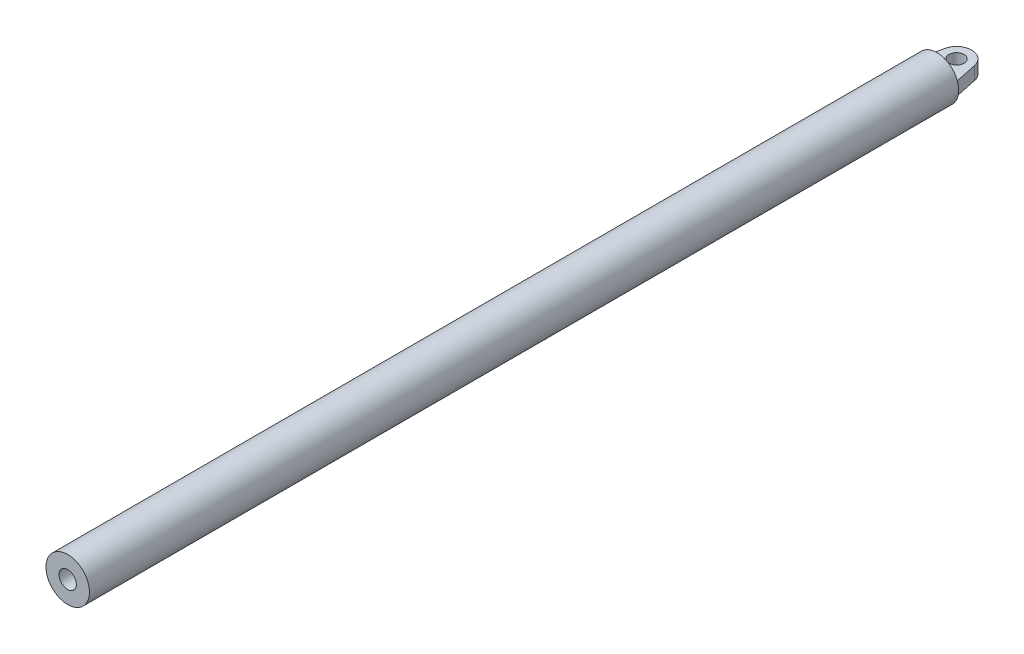
ISO-10303-21;
HEADER;
FILE_DESCRIPTION(('STEP AP214'),'2;1');
FILE_NAME('part.step','',(''),(''),'','','');
FILE_SCHEMA(('AUTOMOTIVE_DESIGN { 1 0 10303 214 1 1 1 1 }'));
ENDSEC;
DATA;
#1=APPLICATION_CONTEXT('core data for automotive mechanical design processes');
#2=APPLICATION_PROTOCOL_DEFINITION('international standard','automotive_design',2000,#1);
#3=PRODUCT_CONTEXT('',#1,'mechanical');
#4=PRODUCT('Part','Part','',(#3));
#5=PRODUCT_RELATED_PRODUCT_CATEGORY('part','',(#4));
#6=PRODUCT_DEFINITION_FORMATION('','',#4);
#7=PRODUCT_DEFINITION_CONTEXT('part definition',#1,'design');
#8=PRODUCT_DEFINITION('design','',#6,#7);
#9=PRODUCT_DEFINITION_SHAPE('','',#8);
#10=(LENGTH_UNIT() NAMED_UNIT(*) SI_UNIT(.MILLI.,.METRE.));
#11=(NAMED_UNIT(*) PLANE_ANGLE_UNIT() SI_UNIT($,.RADIAN.));
#12=(NAMED_UNIT(*) SI_UNIT($,.STERADIAN.) SOLID_ANGLE_UNIT());
#13=UNCERTAINTY_MEASURE_WITH_UNIT(LENGTH_MEASURE(1.E-05),#10,'distance_accuracy_value','');
#14=(GEOMETRIC_REPRESENTATION_CONTEXT(3) GLOBAL_UNCERTAINTY_ASSIGNED_CONTEXT((#13)) GLOBAL_UNIT_ASSIGNED_CONTEXT((#10,
#11,#12)) REPRESENTATION_CONTEXT('',''));
#15=CARTESIAN_POINT('',(0.,0.,0.));
#16=DIRECTION('',(0.,0.,1.));
#17=DIRECTION('',(1.,0.,0.));
#18=AXIS2_PLACEMENT_3D('',#15,#16,#17);
#19=CARTESIAN_POINT('',(0.,0.,2000.));
#20=DIRECTION('',(0.,0.,-1.));
#21=DIRECTION('',(-1.,0.,0.));
#22=AXIS2_PLACEMENT_3D('',#19,#20,#21);
#23=CYLINDRICAL_SURFACE('',#22,50.);
#24=CARTESIAN_POINT('',(0.,0.,2000.));
#25=DIRECTION('',(0.,0.,1.));
#26=DIRECTION('',(1.,0.,0.));
#27=AXIS2_PLACEMENT_3D('',#24,#25,#26);
#28=CIRCLE('',#27,50.);
#29=CARTESIAN_POINT('',(50.,0.,2000.));
#30=VERTEX_POINT('',#29);
#31=EDGE_CURVE('E11',#30,#30,#28,.T.);
#32=ORIENTED_EDGE('',*,*,#31,.F.);
#33=EDGE_LOOP('',(#32));
#34=FACE_BOUND('',#33,.T.);
#35=CARTESIAN_POINT('',(0.,0.,0.));
#36=DIRECTION('',(0.,0.,1.));
#37=DIRECTION('',(1.,0.,0.));
#38=AXIS2_PLACEMENT_3D('',#35,#36,#37);
#39=CIRCLE('',#38,50.);
#40=CARTESIAN_POINT('',(50.,0.,0.));
#41=VERTEX_POINT('',#40);
#42=EDGE_CURVE('E37',#41,#41,#39,.T.);
#43=ORIENTED_EDGE('',*,*,#42,.T.);
#44=EDGE_LOOP('',(#43));
#45=FACE_BOUND('',#44,.T.);
#46=ADVANCED_FACE('F34',(#34,#45),#23,.T.);
#47=CARTESIAN_POINT('',(0.,0.,2000.));
#48=DIRECTION('',(0.,0.,1.));
#49=DIRECTION('',(1.,0.,0.));
#50=AXIS2_PLACEMENT_3D('',#47,#48,#49);
#51=PLANE('',#50);
#52=CARTESIAN_POINT('',(0.,0.,2000.));
#53=DIRECTION('',(0.,0.,1.));
#54=DIRECTION('',(1.,0.,0.));
#55=AXIS2_PLACEMENT_3D('',#52,#53,#54);
#56=CIRCLE('',#55,20.);
#57=CARTESIAN_POINT('',(20.,0.,2000.));
#58=VERTEX_POINT('',#57);
#59=EDGE_CURVE('E116',#58,#58,#56,.T.);
#60=ORIENTED_EDGE('',*,*,#59,.F.);
#61=EDGE_LOOP('',(#60));
#62=FACE_BOUND('',#61,.T.);
#63=ORIENTED_EDGE('',*,*,#31,.T.);
#64=EDGE_LOOP('',(#63));
#65=FACE_BOUND('',#64,.T.);
#66=ADVANCED_FACE('F127',(#62,#65),#51,.T.);
#67=CARTESIAN_POINT('',(0.,0.,0.));
#68=DIRECTION('',(0.,0.,1.));
#69=DIRECTION('',(1.,0.,0.));
#70=AXIS2_PLACEMENT_3D('',#67,#68,#69);
#71=PLANE('',#70);
#72=DIRECTION('',(0.,-1.,0.));
#73=VECTOR('',#72,1.);
#74=CARTESIAN_POINT('',(-45.,15.,0.));
#75=LINE('',#74,#73);
#76=CARTESIAN_POINT('',(-45.,15.,0.));
#77=VERTEX_POINT('',#76);
#78=CARTESIAN_POINT('',(-45.,-15.,0.));
#79=VERTEX_POINT('',#78);
#80=EDGE_CURVE('E99',#77,#79,#75,.T.);
#81=ORIENTED_EDGE('',*,*,#80,.T.);
#82=DIRECTION('',(1.,0.,0.));
#83=VECTOR('',#82,1.);
#84=CARTESIAN_POINT('',(-45.,-15.,0.));
#85=LINE('',#84,#83);
#86=CARTESIAN_POINT('',(45.,-15.,0.));
#87=VERTEX_POINT('',#86);
#88=EDGE_CURVE('E48',#79,#87,#85,.T.);
#89=ORIENTED_EDGE('',*,*,#88,.T.);
#90=DIRECTION('',(0.,-1.,0.));
#91=VECTOR('',#90,1.);
#92=CARTESIAN_POINT('',(45.,15.,0.));
#93=LINE('',#92,#91);
#94=CARTESIAN_POINT('',(45.,15.,0.));
#95=VERTEX_POINT('',#94);
#96=EDGE_CURVE('E94',#95,#87,#93,.T.);
#97=ORIENTED_EDGE('',*,*,#96,.F.);
#98=DIRECTION('',(1.,0.,0.));
#99=VECTOR('',#98,1.);
#100=CARTESIAN_POINT('',(-45.,15.,0.));
#101=LINE('',#100,#99);
#102=EDGE_CURVE('E88',#77,#95,#101,.T.);
#103=ORIENTED_EDGE('',*,*,#102,.F.);
#104=EDGE_LOOP('',(#81,#89,#97,#103));
#105=FACE_BOUND('',#104,.T.);
#106=ORIENTED_EDGE('',*,*,#42,.F.);
#107=EDGE_LOOP('',(#106));
#108=FACE_BOUND('',#107,.T.);
#109=ADVANCED_FACE('F124',(#105,#108),#71,.F.);
#110=CARTESIAN_POINT('',(0.,0.,2000.));
#111=DIRECTION('',(0.,0.,-1.));
#112=DIRECTION('',(-1.,0.,0.));
#113=AXIS2_PLACEMENT_3D('',#110,#111,#112);
#114=CYLINDRICAL_SURFACE('',#113,20.);
#115=ORIENTED_EDGE('',*,*,#59,.T.);
#116=EDGE_LOOP('',(#115));
#117=FACE_BOUND('',#116,.T.);
#118=CARTESIAN_POINT('',(0.,0.,30.));
#119=DIRECTION('',(0.,0.,1.));
#120=DIRECTION('',(1.,0.,0.));
#121=AXIS2_PLACEMENT_3D('',#118,#119,#120);
#122=CIRCLE('',#121,20.);
#123=CARTESIAN_POINT('',(20.,0.,30.));
#124=VERTEX_POINT('',#123);
#125=EDGE_CURVE('E113',#124,#124,#122,.T.);
#126=ORIENTED_EDGE('',*,*,#125,.F.);
#127=EDGE_LOOP('',(#126));
#128=FACE_BOUND('',#127,.T.);
#129=ADVANCED_FACE('F126',(#117,#128),#114,.F.);
#130=CARTESIAN_POINT('',(0.,0.,30.));
#131=DIRECTION('',(0.,0.,1.));
#132=DIRECTION('',(1.,0.,0.));
#133=AXIS2_PLACEMENT_3D('',#130,#131,#132);
#134=PLANE('',#133);
#135=ORIENTED_EDGE('',*,*,#125,.T.);
#136=EDGE_LOOP('',(#135));
#137=FACE_BOUND('',#136,.T.);
#138=ADVANCED_FACE('F133',(#137),#134,.T.);
#139=CARTESIAN_POINT('',(0.,15.,-45.));
#140=DIRECTION('',(0.,-1.,0.));
#141=DIRECTION('',(0.,0.,-1.));
#142=AXIS2_PLACEMENT_3D('',#139,#140,#141);
#143=PLANE('',#142);
#144=ORIENTED_EDGE('',*,*,#102,.T.);
#145=DIRECTION('',(-0.201674767374147,0.,-0.979452545151925));
#146=VECTOR('',#145,1.);
#147=CARTESIAN_POINT('',(34.2808390803174,15.,-52.0586168580951));
#148=LINE('',#147,#146);
#149=CARTESIAN_POINT('',(34.2808390803174,15.,-52.0586168580952));
#150=VERTEX_POINT('',#149);
#151=EDGE_CURVE('E82',#95,#150,#148,.T.);
#152=ORIENTED_EDGE('',*,*,#151,.T.);
#153=CARTESIAN_POINT('',(0.,15.,-45.));
#154=DIRECTION('',(0.,1.,0.));
#155=DIRECTION('',(0.,0.,-1.));
#156=AXIS2_PLACEMENT_3D('',#153,#154,#155);
#157=CIRCLE('',#156,35.);
#158=CARTESIAN_POINT('',(-34.2808390803174,15.,-52.0586168580951));
#159=VERTEX_POINT('',#158);
#160=EDGE_CURVE('E86',#150,#159,#157,.T.);
#161=ORIENTED_EDGE('',*,*,#160,.T.);
#162=DIRECTION('',(-0.201674767374147,0.,0.979452545151925));
#163=VECTOR('',#162,1.);
#164=CARTESIAN_POINT('',(-45.,15.,0.));
#165=LINE('',#164,#163);
#166=EDGE_CURVE('E57',#159,#77,#165,.T.);
#167=ORIENTED_EDGE('',*,*,#166,.T.);
#168=EDGE_LOOP('',(#144,#152,#161,#167));
#169=FACE_BOUND('',#168,.T.);
#170=CARTESIAN_POINT('',(0.,15.,-45.));
#171=DIRECTION('',(0.,1.,0.));
#172=DIRECTION('',(0.,0.,1.));
#173=AXIS2_PLACEMENT_3D('',#170,#171,#172);
#174=CIRCLE('',#173,17.5);
#175=CARTESIAN_POINT('',(0.,15.,-27.5));
#176=VERTEX_POINT('',#175);
#177=EDGE_CURVE('E104',#176,#176,#174,.T.);
#178=ORIENTED_EDGE('',*,*,#177,.F.);
#179=EDGE_LOOP('',(#178));
#180=FACE_BOUND('',#179,.T.);
#181=ADVANCED_FACE('F83',(#169,#180),#143,.F.);
#182=CARTESIAN_POINT('',(0.,-15.,-45.));
#183=DIRECTION('',(0.,-1.,0.));
#184=DIRECTION('',(0.,0.,-1.));
#185=AXIS2_PLACEMENT_3D('',#182,#183,#184);
#186=PLANE('',#185);
#187=ORIENTED_EDGE('',*,*,#88,.F.);
#188=DIRECTION('',(-0.201674767374147,0.,0.979452545151925));
#189=VECTOR('',#188,1.);
#190=CARTESIAN_POINT('',(-45.,-15.,0.));
#191=LINE('',#190,#189);
#192=CARTESIAN_POINT('',(-34.2808390803174,-15.,-52.0586168580951));
#193=VERTEX_POINT('',#192);
#194=EDGE_CURVE('E107',#193,#79,#191,.T.);
#195=ORIENTED_EDGE('',*,*,#194,.F.);
#196=CARTESIAN_POINT('',(0.,-15.,-45.));
#197=DIRECTION('',(0.,1.,0.));
#198=DIRECTION('',(0.,0.,-1.));
#199=AXIS2_PLACEMENT_3D('',#196,#197,#198);
#200=CIRCLE('',#199,35.);
#201=CARTESIAN_POINT('',(34.2808390803174,-15.,-52.0586168580952));
#202=VERTEX_POINT('',#201);
#203=EDGE_CURVE('E74',#202,#193,#200,.T.);
#204=ORIENTED_EDGE('',*,*,#203,.F.);
#205=DIRECTION('',(-0.201674767374147,0.,-0.979452545151925));
#206=VECTOR('',#205,1.);
#207=CARTESIAN_POINT('',(34.2808390803174,-15.,-52.0586168580951));
#208=LINE('',#207,#206);
#209=EDGE_CURVE('E93',#87,#202,#208,.T.);
#210=ORIENTED_EDGE('',*,*,#209,.F.);
#211=EDGE_LOOP('',(#187,#195,#204,#210));
#212=FACE_BOUND('',#211,.T.);
#213=CARTESIAN_POINT('',(0.,-15.,-45.));
#214=DIRECTION('',(0.,1.,0.));
#215=DIRECTION('',(0.,0.,1.));
#216=AXIS2_PLACEMENT_3D('',#213,#214,#215);
#217=CIRCLE('',#216,17.5);
#218=CARTESIAN_POINT('',(0.,-15.,-27.5));
#219=VERTEX_POINT('',#218);
#220=EDGE_CURVE('E228',#219,#219,#217,.T.);
#221=ORIENTED_EDGE('',*,*,#220,.T.);
#222=EDGE_LOOP('',(#221));
#223=FACE_BOUND('',#222,.T.);
#224=ADVANCED_FACE('F175',(#212,#223),#186,.T.);
#225=CARTESIAN_POINT('',(34.2808390803174,15.,-52.0586168580951));
#226=DIRECTION('',(-0.979452545151925,0.,0.201674767374147));
#227=DIRECTION('',(0.201674767374147,0.,0.979452545151925));
#228=AXIS2_PLACEMENT_3D('',#225,#226,#227);
#229=PLANE('',#228);
#230=ORIENTED_EDGE('',*,*,#209,.T.);
#231=DIRECTION('',(0.,-1.,0.));
#232=VECTOR('',#231,1.);
#233=CARTESIAN_POINT('',(34.2808390803174,15.,-52.0586168580952));
#234=LINE('',#233,#232);
#235=EDGE_CURVE('E91',#150,#202,#234,.T.);
#236=ORIENTED_EDGE('',*,*,#235,.F.);
#237=ORIENTED_EDGE('',*,*,#151,.F.);
#238=ORIENTED_EDGE('',*,*,#96,.T.);
#239=EDGE_LOOP('',(#230,#236,#237,#238));
#240=FACE_BOUND('',#239,.T.);
#241=ADVANCED_FACE('F92',(#240),#229,.F.);
#242=CARTESIAN_POINT('',(0.,15.,-45.));
#243=DIRECTION('',(0.,-1.,0.));
#244=DIRECTION('',(0.,0.,-1.));
#245=AXIS2_PLACEMENT_3D('',#242,#243,#244);
#246=CYLINDRICAL_SURFACE('',#245,35.);
#247=ORIENTED_EDGE('',*,*,#203,.T.);
#248=DIRECTION('',(0.,-1.,0.));
#249=VECTOR('',#248,1.);
#250=CARTESIAN_POINT('',(-34.2808390803174,15.,-52.0586168580951));
#251=LINE('',#250,#249);
#252=EDGE_CURVE('E95',#159,#193,#251,.T.);
#253=ORIENTED_EDGE('',*,*,#252,.F.);
#254=ORIENTED_EDGE('',*,*,#160,.F.);
#255=ORIENTED_EDGE('',*,*,#235,.T.);
#256=EDGE_LOOP('',(#247,#253,#254,#255));
#257=FACE_BOUND('',#256,.T.);
#258=ADVANCED_FACE('F97',(#257),#246,.T.);
#259=CARTESIAN_POINT('',(-45.,15.,0.));
#260=DIRECTION('',(0.979452545151925,0.,0.201674767374147));
#261=DIRECTION('',(0.201674767374147,0.,-0.979452545151925));
#262=AXIS2_PLACEMENT_3D('',#259,#260,#261);
#263=PLANE('',#262);
#264=ORIENTED_EDGE('',*,*,#194,.T.);
#265=ORIENTED_EDGE('',*,*,#80,.F.);
#266=ORIENTED_EDGE('',*,*,#166,.F.);
#267=ORIENTED_EDGE('',*,*,#252,.T.);
#268=EDGE_LOOP('',(#264,#265,#266,#267));
#269=FACE_BOUND('',#268,.T.);
#270=ADVANCED_FACE('F200',(#269),#263,.F.);
#271=CARTESIAN_POINT('',(0.,15.,-45.));
#272=DIRECTION('',(0.,-1.,0.));
#273=DIRECTION('',(0.,0.,-1.));
#274=AXIS2_PLACEMENT_3D('',#271,#272,#273);
#275=CYLINDRICAL_SURFACE('',#274,17.5);
#276=ORIENTED_EDGE('',*,*,#177,.T.);
#277=EDGE_LOOP('',(#276));
#278=FACE_BOUND('',#277,.T.);
#279=ORIENTED_EDGE('',*,*,#220,.F.);
#280=EDGE_LOOP('',(#279));
#281=FACE_BOUND('',#280,.T.);
#282=ADVANCED_FACE('F209',(#278,#281),#275,.F.);
#283=CLOSED_SHELL('',(#46,#66,#109,#129,#138,#181,#224,#241,#258,#270,#282));
#284=MANIFOLD_SOLID_BREP('B2',#283);
#285=ADVANCED_BREP_SHAPE_REPRESENTATION('',(#18,#284),#14);
#286=SHAPE_DEFINITION_REPRESENTATION(#9,#285);
ENDSEC;
END-ISO-10303-21;
